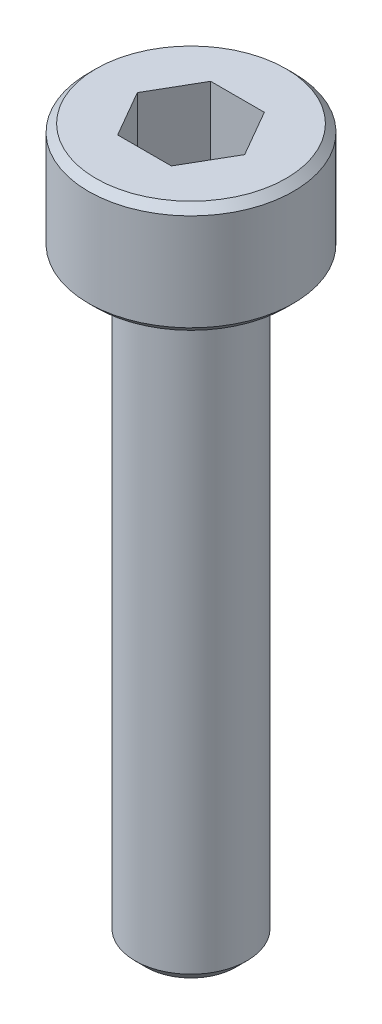
ISO-10303-21;
HEADER;
FILE_DESCRIPTION(('STEP AP214'),'2;1');
FILE_NAME('part.step','',(''),(''),'','','');
FILE_SCHEMA(('AUTOMOTIVE_DESIGN { 1 0 10303 214 1 1 1 1 }'));
ENDSEC;
DATA;
#1=APPLICATION_CONTEXT('core data for automotive mechanical design processes');
#2=APPLICATION_PROTOCOL_DEFINITION('international standard','automotive_design',2000,#1);
#3=PRODUCT_CONTEXT('',#1,'mechanical');
#4=PRODUCT('Part','Part','',(#3));
#5=PRODUCT_RELATED_PRODUCT_CATEGORY('part','',(#4));
#6=PRODUCT_DEFINITION_FORMATION('','',#4);
#7=PRODUCT_DEFINITION_CONTEXT('part definition',#1,'design');
#8=PRODUCT_DEFINITION('design','',#6,#7);
#9=PRODUCT_DEFINITION_SHAPE('','',#8);
#10=(LENGTH_UNIT() NAMED_UNIT(*) SI_UNIT(.MILLI.,.METRE.));
#11=(NAMED_UNIT(*) PLANE_ANGLE_UNIT() SI_UNIT($,.RADIAN.));
#12=(NAMED_UNIT(*) SI_UNIT($,.STERADIAN.) SOLID_ANGLE_UNIT());
#13=UNCERTAINTY_MEASURE_WITH_UNIT(LENGTH_MEASURE(1.E-05),#10,'distance_accuracy_value','');
#14=(GEOMETRIC_REPRESENTATION_CONTEXT(3) GLOBAL_UNCERTAINTY_ASSIGNED_CONTEXT((#13)) GLOBAL_UNIT_ASSIGNED_CONTEXT((#10,
#11,#12)) REPRESENTATION_CONTEXT('',''));
#15=CARTESIAN_POINT('',(0.,0.,0.));
#16=DIRECTION('',(0.,0.,1.));
#17=DIRECTION('',(1.,0.,0.));
#18=AXIS2_PLACEMENT_3D('',#15,#16,#17);
#19=CARTESIAN_POINT('',(1.5,-16.,0.));
#20=DIRECTION('',(0.,1.,0.));
#21=DIRECTION('',(0.,0.,1.));
#22=AXIS2_PLACEMENT_3D('',#19,#20,#21);
#23=PLANE('',#22);
#24=CARTESIAN_POINT('',(0.,-16.,0.));
#25=DIRECTION('',(0.,1.,0.));
#26=DIRECTION('',(0.,0.,1.));
#27=AXIS2_PLACEMENT_3D('',#24,#25,#26);
#28=CIRCLE('',#27,1.2);
#29=CARTESIAN_POINT('',(0.,-16.,1.2));
#30=VERTEX_POINT('',#29);
#31=EDGE_CURVE('E11',#30,#30,#28,.F.);
#32=ORIENTED_EDGE('',*,*,#31,.T.);
#33=EDGE_LOOP('',(#32));
#34=FACE_BOUND('',#33,.T.);
#35=ADVANCED_FACE('F41',(#34),#23,.F.);
#36=CARTESIAN_POINT('',(0.,3.,0.));
#37=DIRECTION('',(0.,1.,0.));
#38=DIRECTION('',(0.,0.,1.));
#39=AXIS2_PLACEMENT_3D('',#36,#37,#38);
#40=CYLINDRICAL_SURFACE('',#39,1.5);
#41=CARTESIAN_POINT('',(0.,-15.7,0.));
#42=DIRECTION('',(0.,1.,0.));
#43=DIRECTION('',(0.,0.,1.));
#44=AXIS2_PLACEMENT_3D('',#41,#42,#43);
#45=CIRCLE('',#44,1.5);
#46=CARTESIAN_POINT('',(0.,-15.7,1.5));
#47=VERTEX_POINT('',#46);
#48=EDGE_CURVE('E51',#47,#47,#45,.T.);
#49=ORIENTED_EDGE('',*,*,#48,.T.);
#50=EDGE_LOOP('',(#49));
#51=FACE_BOUND('',#50,.T.);
#52=CARTESIAN_POINT('',(0.,0.,0.));
#53=DIRECTION('',(0.,1.,0.));
#54=DIRECTION('',(0.,0.,1.));
#55=AXIS2_PLACEMENT_3D('',#52,#53,#54);
#56=CIRCLE('',#55,1.5);
#57=CARTESIAN_POINT('',(0.,0.,1.5));
#58=VERTEX_POINT('',#57);
#59=EDGE_CURVE('E157',#58,#58,#56,.T.);
#60=ORIENTED_EDGE('',*,*,#59,.F.);
#61=EDGE_LOOP('',(#60));
#62=FACE_BOUND('',#61,.T.);
#63=ADVANCED_FACE('F189',(#51,#62),#40,.T.);
#64=CARTESIAN_POINT('',(1.5,0.,0.));
#65=DIRECTION('',(0.,1.,0.));
#66=DIRECTION('',(0.,0.,1.));
#67=AXIS2_PLACEMENT_3D('',#64,#65,#66);
#68=PLANE('',#67);
#69=CARTESIAN_POINT('',(0.,0.,0.));
#70=DIRECTION('',(0.,1.,0.));
#71=DIRECTION('',(0.,0.,1.));
#72=AXIS2_PLACEMENT_3D('',#69,#70,#71);
#73=CIRCLE('',#72,2.55);
#74=CARTESIAN_POINT('',(0.,0.,2.55));
#75=VERTEX_POINT('',#74);
#76=EDGE_CURVE('E178',#75,#75,#73,.F.);
#77=ORIENTED_EDGE('',*,*,#76,.T.);
#78=EDGE_LOOP('',(#77));
#79=FACE_BOUND('',#78,.T.);
#80=ORIENTED_EDGE('',*,*,#59,.T.);
#81=EDGE_LOOP('',(#80));
#82=FACE_BOUND('',#81,.T.);
#83=ADVANCED_FACE('F211',(#79,#82),#68,.F.);
#84=CARTESIAN_POINT('',(0.,3.,0.));
#85=DIRECTION('',(0.,1.,0.));
#86=DIRECTION('',(0.,0.,1.));
#87=AXIS2_PLACEMENT_3D('',#84,#85,#86);
#88=CYLINDRICAL_SURFACE('',#87,2.75);
#89=CARTESIAN_POINT('',(0.,0.199999999999999,0.));
#90=DIRECTION('',(0.,1.,0.));
#91=DIRECTION('',(0.,0.,1.));
#92=AXIS2_PLACEMENT_3D('',#89,#90,#91);
#93=CIRCLE('',#92,2.75);
#94=CARTESIAN_POINT('',(0.,0.199999999999999,2.75));
#95=VERTEX_POINT('',#94);
#96=EDGE_CURVE('E174',#95,#95,#93,.T.);
#97=ORIENTED_EDGE('',*,*,#96,.T.);
#98=EDGE_LOOP('',(#97));
#99=FACE_BOUND('',#98,.T.);
#100=CARTESIAN_POINT('',(0.,2.8,0.));
#101=DIRECTION('',(0.,-1.,0.));
#102=DIRECTION('',(0.,0.,-1.));
#103=AXIS2_PLACEMENT_3D('',#100,#101,#102);
#104=CIRCLE('',#103,2.75);
#105=CARTESIAN_POINT('',(0.,2.8,-2.75));
#106=VERTEX_POINT('',#105);
#107=EDGE_CURVE('E170',#106,#106,#104,.T.);
#108=ORIENTED_EDGE('',*,*,#107,.T.);
#109=EDGE_LOOP('',(#108));
#110=FACE_BOUND('',#109,.T.);
#111=ADVANCED_FACE('F229',(#99,#110),#88,.T.);
#112=CARTESIAN_POINT('',(2.75,3.,0.));
#113=DIRECTION('',(0.,-1.,0.));
#114=DIRECTION('',(0.,0.,-1.));
#115=AXIS2_PLACEMENT_3D('',#112,#113,#114);
#116=PLANE('',#115);
#117=DIRECTION('',(0.5,0.,0.866025403784439));
#118=VECTOR('',#117,1.);
#119=CARTESIAN_POINT('',(-0.72,3.,1.24707658144959));
#120=LINE('',#119,#118);
#121=CARTESIAN_POINT('',(-1.44,3.,0.));
#122=VERTEX_POINT('',#121);
#123=CARTESIAN_POINT('',(-0.72,3.,1.24707658144959));
#124=VERTEX_POINT('',#123);
#125=EDGE_CURVE('E138',#122,#124,#120,.T.);
#126=ORIENTED_EDGE('',*,*,#125,.F.);
#127=DIRECTION('',(-0.5,0.,0.866025403784439));
#128=VECTOR('',#127,1.);
#129=CARTESIAN_POINT('',(-1.44,3.,0.));
#130=LINE('',#129,#128);
#131=CARTESIAN_POINT('',(-0.72,3.,-1.24707658144959));
#132=VERTEX_POINT('',#131);
#133=EDGE_CURVE('E58',#132,#122,#130,.T.);
#134=ORIENTED_EDGE('',*,*,#133,.F.);
#135=DIRECTION('',(-1.,0.,0.));
#136=VECTOR('',#135,1.);
#137=CARTESIAN_POINT('',(-0.72,3.,-1.24707658144959));
#138=LINE('',#137,#136);
#139=CARTESIAN_POINT('',(0.72,3.,-1.24707658144959));
#140=VERTEX_POINT('',#139);
#141=EDGE_CURVE('E151',#140,#132,#138,.T.);
#142=ORIENTED_EDGE('',*,*,#141,.F.);
#143=DIRECTION('',(-0.5,0.,-0.866025403784439));
#144=VECTOR('',#143,1.);
#145=CARTESIAN_POINT('',(0.72,3.,-1.24707658144959));
#146=LINE('',#145,#144);
#147=CARTESIAN_POINT('',(1.44,3.,0.));
#148=VERTEX_POINT('',#147);
#149=EDGE_CURVE('E148',#148,#140,#146,.T.);
#150=ORIENTED_EDGE('',*,*,#149,.F.);
#151=DIRECTION('',(0.5,0.,-0.866025403784439));
#152=VECTOR('',#151,1.);
#153=CARTESIAN_POINT('',(1.44,3.,0.));
#154=LINE('',#153,#152);
#155=CARTESIAN_POINT('',(0.72,3.,1.24707658144959));
#156=VERTEX_POINT('',#155);
#157=EDGE_CURVE('E106',#156,#148,#154,.T.);
#158=ORIENTED_EDGE('',*,*,#157,.F.);
#159=DIRECTION('',(1.,0.,0.));
#160=VECTOR('',#159,1.);
#161=CARTESIAN_POINT('',(0.72,3.,1.24707658144959));
#162=LINE('',#161,#160);
#163=EDGE_CURVE('E142',#124,#156,#162,.T.);
#164=ORIENTED_EDGE('',*,*,#163,.F.);
#165=EDGE_LOOP('',(#126,#134,#142,#150,#158,#164));
#166=FACE_BOUND('',#165,.T.);
#167=CARTESIAN_POINT('',(0.,3.,0.));
#168=DIRECTION('',(0.,-1.,0.));
#169=DIRECTION('',(0.,0.,-1.));
#170=AXIS2_PLACEMENT_3D('',#167,#168,#169);
#171=CIRCLE('',#170,2.55);
#172=CARTESIAN_POINT('',(0.,3.,-2.55));
#173=VERTEX_POINT('',#172);
#174=EDGE_CURVE('E182',#173,#173,#171,.F.);
#175=ORIENTED_EDGE('',*,*,#174,.T.);
#176=EDGE_LOOP('',(#175));
#177=FACE_BOUND('',#176,.T.);
#178=ADVANCED_FACE('F220',(#166,#177),#116,.F.);
#179=CARTESIAN_POINT('',(0.,0.199999999999999,0.));
#180=DIRECTION('',(0.,1.,0.));
#181=DIRECTION('',(0.,0.,1.));
#182=AXIS2_PLACEMENT_3D('',#179,#180,#181);
#183=CONICAL_SURFACE('',#182,2.75,0.78539816339745);
#184=ORIENTED_EDGE('',*,*,#76,.F.);
#185=EDGE_LOOP('',(#184));
#186=FACE_BOUND('',#185,.T.);
#187=ORIENTED_EDGE('',*,*,#96,.F.);
#188=EDGE_LOOP('',(#187));
#189=FACE_BOUND('',#188,.T.);
#190=ADVANCED_FACE('F202',(#186,#189),#183,.T.);
#191=CARTESIAN_POINT('',(0.,3.,0.));
#192=DIRECTION('',(0.,-1.,0.));
#193=DIRECTION('',(0.,0.,-1.));
#194=AXIS2_PLACEMENT_3D('',#191,#192,#193);
#195=CONICAL_SURFACE('',#194,2.55,0.785398163397438);
#196=ORIENTED_EDGE('',*,*,#107,.F.);
#197=EDGE_LOOP('',(#196));
#198=FACE_BOUND('',#197,.T.);
#199=ORIENTED_EDGE('',*,*,#174,.F.);
#200=EDGE_LOOP('',(#199));
#201=FACE_BOUND('',#200,.T.);
#202=ADVANCED_FACE('F194',(#198,#201),#195,.T.);
#203=CARTESIAN_POINT('',(0.,-15.7,0.));
#204=DIRECTION('',(0.,1.,0.));
#205=DIRECTION('',(0.,0.,1.));
#206=AXIS2_PLACEMENT_3D('',#203,#204,#205);
#207=CONICAL_SURFACE('',#206,1.5,0.785398163397452);
#208=ORIENTED_EDGE('',*,*,#31,.F.);
#209=EDGE_LOOP('',(#208));
#210=FACE_BOUND('',#209,.T.);
#211=ORIENTED_EDGE('',*,*,#48,.F.);
#212=EDGE_LOOP('',(#211));
#213=FACE_BOUND('',#212,.T.);
#214=ADVANCED_FACE('F44',(#210,#213),#207,.T.);
#215=CARTESIAN_POINT('',(-1.44,0.5,0.));
#216=DIRECTION('',(-0.866025403784439,0.,-0.5));
#217=DIRECTION('',(-0.5,0.,0.866025403784439));
#218=AXIS2_PLACEMENT_3D('',#215,#216,#217);
#219=PLANE('',#218);
#220=ORIENTED_EDGE('',*,*,#133,.T.);
#221=DIRECTION('',(0.,1.,0.));
#222=VECTOR('',#221,1.);
#223=CARTESIAN_POINT('',(-1.44,0.5,0.));
#224=LINE('',#223,#222);
#225=CARTESIAN_POINT('',(-1.44,0.5,0.));
#226=VERTEX_POINT('',#225);
#227=EDGE_CURVE('E88',#226,#122,#224,.T.);
#228=ORIENTED_EDGE('',*,*,#227,.F.);
#229=DIRECTION('',(-0.5,0.,0.866025403784439));
#230=VECTOR('',#229,1.);
#231=CARTESIAN_POINT('',(-1.44,0.5,0.));
#232=LINE('',#231,#230);
#233=CARTESIAN_POINT('',(-0.72,0.5,-1.24707658144959));
#234=VERTEX_POINT('',#233);
#235=EDGE_CURVE('E154',#234,#226,#232,.T.);
#236=ORIENTED_EDGE('',*,*,#235,.F.);
#237=DIRECTION('',(0.,1.,0.));
#238=VECTOR('',#237,1.);
#239=CARTESIAN_POINT('',(-0.72,0.5,-1.24707658144959));
#240=LINE('',#239,#238);
#241=EDGE_CURVE('E66',#234,#132,#240,.T.);
#242=ORIENTED_EDGE('',*,*,#241,.T.);
#243=EDGE_LOOP('',(#220,#228,#236,#242));
#244=FACE_BOUND('',#243,.T.);
#245=ADVANCED_FACE('F193',(#244),#219,.F.);
#246=CARTESIAN_POINT('',(-0.72,0.5,-1.24707658144959));
#247=DIRECTION('',(0.,0.,-1.));
#248=DIRECTION('',(-1.,0.,0.));
#249=AXIS2_PLACEMENT_3D('',#246,#247,#248);
#250=PLANE('',#249);
#251=ORIENTED_EDGE('',*,*,#141,.T.);
#252=ORIENTED_EDGE('',*,*,#241,.F.);
#253=DIRECTION('',(-1.,0.,0.));
#254=VECTOR('',#253,1.);
#255=CARTESIAN_POINT('',(-0.72,0.5,-1.24707658144959));
#256=LINE('',#255,#254);
#257=CARTESIAN_POINT('',(0.72,0.5,-1.24707658144959));
#258=VERTEX_POINT('',#257);
#259=EDGE_CURVE('E120',#258,#234,#256,.T.);
#260=ORIENTED_EDGE('',*,*,#259,.F.);
#261=DIRECTION('',(0.,1.,0.));
#262=VECTOR('',#261,1.);
#263=CARTESIAN_POINT('',(0.72,0.5,-1.24707658144959));
#264=LINE('',#263,#262);
#265=EDGE_CURVE('E111',#258,#140,#264,.T.);
#266=ORIENTED_EDGE('',*,*,#265,.T.);
#267=EDGE_LOOP('',(#251,#252,#260,#266));
#268=FACE_BOUND('',#267,.T.);
#269=ADVANCED_FACE('F200',(#268),#250,.F.);
#270=CARTESIAN_POINT('',(0.72,0.5,-1.24707658144959));
#271=DIRECTION('',(0.866025403784439,0.,-0.5));
#272=DIRECTION('',(-0.5,0.,-0.866025403784439));
#273=AXIS2_PLACEMENT_3D('',#270,#271,#272);
#274=PLANE('',#273);
#275=ORIENTED_EDGE('',*,*,#149,.T.);
#276=ORIENTED_EDGE('',*,*,#265,.F.);
#277=DIRECTION('',(-0.5,0.,-0.866025403784439));
#278=VECTOR('',#277,1.);
#279=CARTESIAN_POINT('',(0.72,0.5,-1.24707658144959));
#280=LINE('',#279,#278);
#281=CARTESIAN_POINT('',(1.44,0.5,0.));
#282=VERTEX_POINT('',#281);
#283=EDGE_CURVE('E115',#282,#258,#280,.T.);
#284=ORIENTED_EDGE('',*,*,#283,.F.);
#285=DIRECTION('',(0.,1.,0.));
#286=VECTOR('',#285,1.);
#287=CARTESIAN_POINT('',(1.44,0.5,0.));
#288=LINE('',#287,#286);
#289=EDGE_CURVE('E99',#282,#148,#288,.T.);
#290=ORIENTED_EDGE('',*,*,#289,.T.);
#291=EDGE_LOOP('',(#275,#276,#284,#290));
#292=FACE_BOUND('',#291,.T.);
#293=ADVANCED_FACE('F116',(#292),#274,.F.);
#294=CARTESIAN_POINT('',(1.44,0.5,0.));
#295=DIRECTION('',(0.866025403784439,0.,0.5));
#296=DIRECTION('',(0.5,0.,-0.866025403784439));
#297=AXIS2_PLACEMENT_3D('',#294,#295,#296);
#298=PLANE('',#297);
#299=ORIENTED_EDGE('',*,*,#157,.T.);
#300=ORIENTED_EDGE('',*,*,#289,.F.);
#301=DIRECTION('',(0.5,0.,-0.866025403784439));
#302=VECTOR('',#301,1.);
#303=CARTESIAN_POINT('',(1.44,0.5,0.));
#304=LINE('',#303,#302);
#305=CARTESIAN_POINT('',(0.72,0.5,1.24707658144959));
#306=VERTEX_POINT('',#305);
#307=EDGE_CURVE('E103',#306,#282,#304,.T.);
#308=ORIENTED_EDGE('',*,*,#307,.F.);
#309=DIRECTION('',(0.,1.,0.));
#310=VECTOR('',#309,1.);
#311=CARTESIAN_POINT('',(0.72,0.5,1.24707658144959));
#312=LINE('',#311,#310);
#313=EDGE_CURVE('E112',#306,#156,#312,.T.);
#314=ORIENTED_EDGE('',*,*,#313,.T.);
#315=EDGE_LOOP('',(#299,#300,#308,#314));
#316=FACE_BOUND('',#315,.T.);
#317=ADVANCED_FACE('F101',(#316),#298,.F.);
#318=CARTESIAN_POINT('',(0.72,0.5,1.24707658144959));
#319=DIRECTION('',(0.,0.,1.));
#320=DIRECTION('',(1.,0.,0.));
#321=AXIS2_PLACEMENT_3D('',#318,#319,#320);
#322=PLANE('',#321);
#323=ORIENTED_EDGE('',*,*,#163,.T.);
#324=ORIENTED_EDGE('',*,*,#313,.F.);
#325=DIRECTION('',(1.,0.,0.));
#326=VECTOR('',#325,1.);
#327=CARTESIAN_POINT('',(0.72,0.5,1.24707658144959));
#328=LINE('',#327,#326);
#329=CARTESIAN_POINT('',(-0.72,0.5,1.24707658144959));
#330=VERTEX_POINT('',#329);
#331=EDGE_CURVE('E126',#330,#306,#328,.T.);
#332=ORIENTED_EDGE('',*,*,#331,.F.);
#333=DIRECTION('',(0.,1.,0.));
#334=VECTOR('',#333,1.);
#335=CARTESIAN_POINT('',(-0.72,0.5,1.24707658144959));
#336=LINE('',#335,#334);
#337=EDGE_CURVE('E162',#330,#124,#336,.T.);
#338=ORIENTED_EDGE('',*,*,#337,.T.);
#339=EDGE_LOOP('',(#323,#324,#332,#338));
#340=FACE_BOUND('',#339,.T.);
#341=ADVANCED_FACE('F251',(#340),#322,.F.);
#342=CARTESIAN_POINT('',(-0.72,0.5,1.24707658144959));
#343=DIRECTION('',(-0.866025403784439,0.,0.5));
#344=DIRECTION('',(0.5,0.,0.866025403784439));
#345=AXIS2_PLACEMENT_3D('',#342,#343,#344);
#346=PLANE('',#345);
#347=ORIENTED_EDGE('',*,*,#125,.T.);
#348=ORIENTED_EDGE('',*,*,#337,.F.);
#349=DIRECTION('',(0.5,0.,0.866025403784439));
#350=VECTOR('',#349,1.);
#351=CARTESIAN_POINT('',(-0.72,0.5,1.24707658144959));
#352=LINE('',#351,#350);
#353=EDGE_CURVE('E130',#226,#330,#352,.T.);
#354=ORIENTED_EDGE('',*,*,#353,.F.);
#355=ORIENTED_EDGE('',*,*,#227,.T.);
#356=EDGE_LOOP('',(#347,#348,#354,#355));
#357=FACE_BOUND('',#356,.T.);
#358=ADVANCED_FACE('F248',(#357),#346,.F.);
#359=CARTESIAN_POINT('',(0.,0.5,0.));
#360=DIRECTION('',(0.,-1.,0.));
#361=DIRECTION('',(0.,0.,-1.));
#362=AXIS2_PLACEMENT_3D('',#359,#360,#361);
#363=PLANE('',#362);
#364=ORIENTED_EDGE('',*,*,#235,.T.);
#365=ORIENTED_EDGE('',*,*,#353,.T.);
#366=ORIENTED_EDGE('',*,*,#331,.T.);
#367=ORIENTED_EDGE('',*,*,#307,.T.);
#368=ORIENTED_EDGE('',*,*,#283,.T.);
#369=ORIENTED_EDGE('',*,*,#259,.T.);
#370=EDGE_LOOP('',(#364,#365,#366,#367,#368,#369));
#371=FACE_BOUND('',#370,.T.);
#372=ADVANCED_FACE('F123',(#371),#363,.F.);
#373=CLOSED_SHELL('',(#35,#63,#83,#111,#178,#190,#202,#214,#245,#269,#293,#317,#341,#358,#372));
#374=MANIFOLD_SOLID_BREP('B2',#373);
#375=ADVANCED_BREP_SHAPE_REPRESENTATION('',(#18,#374),#14);
#376=SHAPE_DEFINITION_REPRESENTATION(#9,#375);
ENDSEC;
END-ISO-10303-21;
